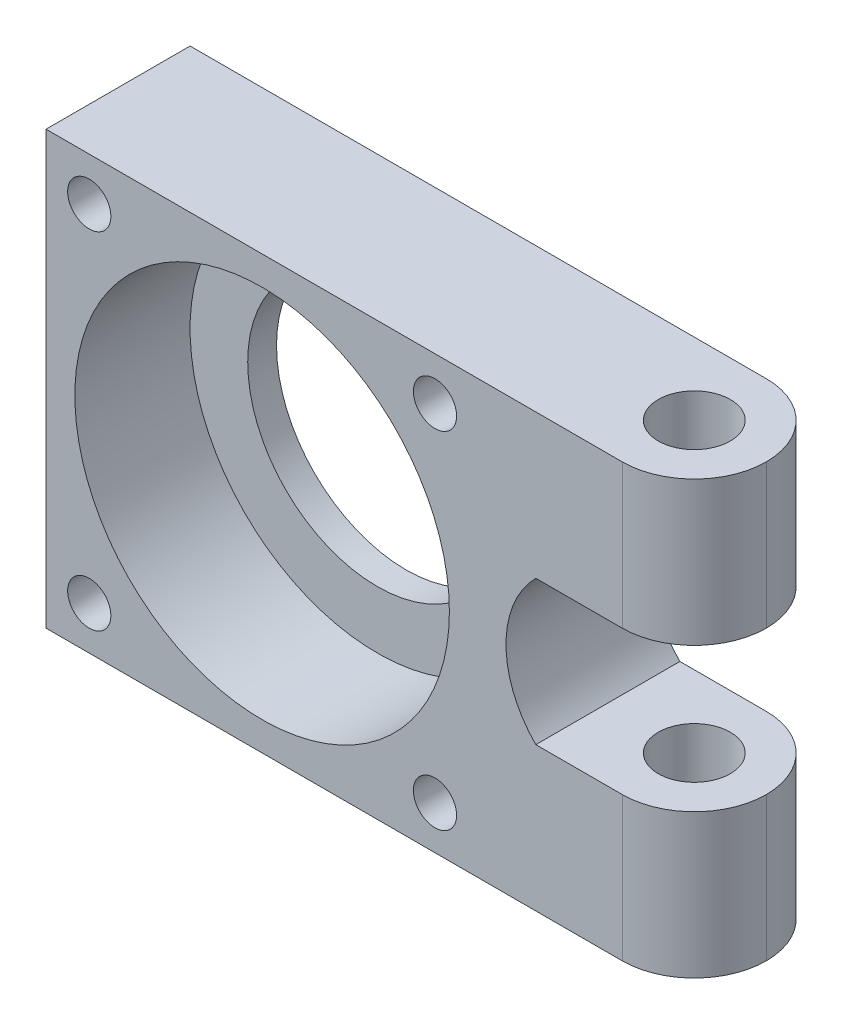
ISO-10303-21;
HEADER;
FILE_DESCRIPTION(('STEP AP214'),'2;1');
FILE_NAME('part.step','',(''),(''),'','','');
FILE_SCHEMA(('AUTOMOTIVE_DESIGN { 1 0 10303 214 1 1 1 1 }'));
ENDSEC;
DATA;
#1=APPLICATION_CONTEXT('core data for automotive mechanical design processes');
#2=APPLICATION_PROTOCOL_DEFINITION('international standard','automotive_design',2000,#1);
#3=PRODUCT_CONTEXT('',#1,'mechanical');
#4=PRODUCT('Part','Part','',(#3));
#5=PRODUCT_RELATED_PRODUCT_CATEGORY('part','',(#4));
#6=PRODUCT_DEFINITION_FORMATION('','',#4);
#7=PRODUCT_DEFINITION_CONTEXT('part definition',#1,'design');
#8=PRODUCT_DEFINITION('design','',#6,#7);
#9=PRODUCT_DEFINITION_SHAPE('','',#8);
#10=(LENGTH_UNIT() NAMED_UNIT(*) SI_UNIT(.MILLI.,.METRE.));
#11=(NAMED_UNIT(*) PLANE_ANGLE_UNIT() SI_UNIT($,.RADIAN.));
#12=(NAMED_UNIT(*) SI_UNIT($,.STERADIAN.) SOLID_ANGLE_UNIT());
#13=UNCERTAINTY_MEASURE_WITH_UNIT(LENGTH_MEASURE(1.E-05),#10,'distance_accuracy_value','');
#14=(GEOMETRIC_REPRESENTATION_CONTEXT(3) GLOBAL_UNCERTAINTY_ASSIGNED_CONTEXT((#13)) GLOBAL_UNIT_ASSIGNED_CONTEXT((#10,
#11,#12)) REPRESENTATION_CONTEXT('',''));
#15=CARTESIAN_POINT('',(0.,0.,0.));
#16=DIRECTION('',(0.,0.,1.));
#17=DIRECTION('',(1.,0.,0.));
#18=AXIS2_PLACEMENT_3D('',#15,#16,#17);
#19=CARTESIAN_POINT('',(-22.5,15.,10.));
#20=DIRECTION('',(1.,0.,0.));
#21=DIRECTION('',(0.,1.,0.));
#22=AXIS2_PLACEMENT_3D('',#19,#20,#21);
#23=PLANE('',#22);
#24=DIRECTION('',(0.,-1.,0.));
#25=VECTOR('',#24,1.);
#26=CARTESIAN_POINT('',(-22.5,15.,0.));
#27=LINE('',#26,#25);
#28=CARTESIAN_POINT('',(-22.5,15.,0.));
#29=VERTEX_POINT('',#28);
#30=CARTESIAN_POINT('',(-22.5,-15.,0.));
#31=VERTEX_POINT('',#30);
#32=EDGE_CURVE('E217',#29,#31,#27,.T.);
#33=ORIENTED_EDGE('',*,*,#32,.T.);
#34=DIRECTION('',(0.,0.,-1.));
#35=VECTOR('',#34,1.);
#36=CARTESIAN_POINT('',(-22.5,-15.,10.));
#37=LINE('',#36,#35);
#38=CARTESIAN_POINT('',(-22.5,-15.,10.));
#39=VERTEX_POINT('',#38);
#40=EDGE_CURVE('E150',#39,#31,#37,.T.);
#41=ORIENTED_EDGE('',*,*,#40,.F.);
#42=DIRECTION('',(0.,-1.,0.));
#43=VECTOR('',#42,1.);
#44=CARTESIAN_POINT('',(-22.5,15.,10.));
#45=LINE('',#44,#43);
#46=CARTESIAN_POINT('',(-22.5,15.,10.));
#47=VERTEX_POINT('',#46);
#48=EDGE_CURVE('E140',#47,#39,#45,.T.);
#49=ORIENTED_EDGE('',*,*,#48,.F.);
#50=DIRECTION('',(0.,0.,-1.));
#51=VECTOR('',#50,1.);
#52=CARTESIAN_POINT('',(-22.5,15.,10.));
#53=LINE('',#52,#51);
#54=EDGE_CURVE('E130',#47,#29,#53,.T.);
#55=ORIENTED_EDGE('',*,*,#54,.T.);
#56=EDGE_LOOP('',(#33,#41,#49,#55));
#57=FACE_BOUND('',#56,.T.);
#58=ADVANCED_FACE('F31',(#57),#23,.F.);
#59=CARTESIAN_POINT('',(-22.5,-15.,10.));
#60=DIRECTION('',(0.,1.,0.));
#61=DIRECTION('',(0.,0.,1.));
#62=AXIS2_PLACEMENT_3D('',#59,#60,#61);
#63=PLANE('',#62);
#64=CARTESIAN_POINT('',(17.5,-15.,5.));
#65=DIRECTION('',(0.,-1.,0.));
#66=DIRECTION('',(0.,0.,-1.));
#67=AXIS2_PLACEMENT_3D('',#64,#65,#66);
#68=CIRCLE('',#67,2.5);
#69=CARTESIAN_POINT('',(17.5,-15.,2.5));
#70=VERTEX_POINT('',#69);
#71=EDGE_CURVE('E120',#70,#70,#68,.T.);
#72=ORIENTED_EDGE('',*,*,#71,.F.);
#73=EDGE_LOOP('',(#72));
#74=FACE_BOUND('',#73,.T.);
#75=DIRECTION('',(1.,0.,0.));
#76=VECTOR('',#75,1.);
#77=CARTESIAN_POINT('',(-22.5,-15.,0.));
#78=LINE('',#77,#76);
#79=CARTESIAN_POINT('',(17.5,-15.,0.));
#80=VERTEX_POINT('',#79);
#81=EDGE_CURVE('E142',#31,#80,#78,.T.);
#82=ORIENTED_EDGE('',*,*,#81,.T.);
#83=CARTESIAN_POINT('',(17.5,-15.,5.));
#84=DIRECTION('',(0.,1.,0.));
#85=DIRECTION('',(0.,0.,1.));
#86=AXIS2_PLACEMENT_3D('',#83,#84,#85);
#87=CIRCLE('',#86,5.);
#88=CARTESIAN_POINT('',(22.5,-15.,5.));
#89=VERTEX_POINT('',#88);
#90=EDGE_CURVE('E11',#80,#89,#87,.F.);
#91=ORIENTED_EDGE('',*,*,#90,.T.);
#92=CARTESIAN_POINT('',(17.5,-15.,5.));
#93=DIRECTION('',(0.,1.,0.));
#94=DIRECTION('',(0.,0.,1.));
#95=AXIS2_PLACEMENT_3D('',#92,#93,#94);
#96=CIRCLE('',#95,5.);
#97=CARTESIAN_POINT('',(17.5,-15.,10.));
#98=VERTEX_POINT('',#97);
#99=EDGE_CURVE('E40',#89,#98,#96,.F.);
#100=ORIENTED_EDGE('',*,*,#99,.T.);
#101=DIRECTION('',(1.,0.,0.));
#102=VECTOR('',#101,1.);
#103=CARTESIAN_POINT('',(-22.5,-15.,10.));
#104=LINE('',#103,#102);
#105=EDGE_CURVE('E220',#39,#98,#104,.T.);
#106=ORIENTED_EDGE('',*,*,#105,.F.);
#107=ORIENTED_EDGE('',*,*,#40,.T.);
#108=EDGE_LOOP('',(#82,#91,#100,#106,#107));
#109=FACE_BOUND('',#108,.T.);
#110=ADVANCED_FACE('F228',(#74,#109),#63,.F.);
#111=CARTESIAN_POINT('',(11.5,-5.,10.));
#112=DIRECTION('',(0.,-1.,0.));
#113=DIRECTION('',(0.,0.,-1.));
#114=AXIS2_PLACEMENT_3D('',#111,#112,#113);
#115=PLANE('',#114);
#116=CARTESIAN_POINT('',(17.5,-5.,5.));
#117=DIRECTION('',(0.,-1.,0.));
#118=DIRECTION('',(0.,0.,-1.));
#119=AXIS2_PLACEMENT_3D('',#116,#117,#118);
#120=CIRCLE('',#119,2.5);
#121=CARTESIAN_POINT('',(17.5,-5.,2.5));
#122=VERTEX_POINT('',#121);
#123=EDGE_CURVE('E214',#122,#122,#120,.T.);
#124=ORIENTED_EDGE('',*,*,#123,.T.);
#125=EDGE_LOOP('',(#124));
#126=FACE_BOUND('',#125,.T.);
#127=CARTESIAN_POINT('',(17.5,-5.,5.));
#128=DIRECTION('',(0.,-1.,0.));
#129=DIRECTION('',(0.,0.,-1.));
#130=AXIS2_PLACEMENT_3D('',#127,#128,#129);
#131=CIRCLE('',#130,5.);
#132=CARTESIAN_POINT('',(17.5,-5.,10.));
#133=VERTEX_POINT('',#132);
#134=CARTESIAN_POINT('',(22.5,-5.,5.));
#135=VERTEX_POINT('',#134);
#136=EDGE_CURVE('E54',#133,#135,#131,.F.);
#137=ORIENTED_EDGE('',*,*,#136,.T.);
#138=CARTESIAN_POINT('',(17.5,-5.,5.));
#139=DIRECTION('',(0.,-1.,0.));
#140=DIRECTION('',(0.,0.,-1.));
#141=AXIS2_PLACEMENT_3D('',#138,#139,#140);
#142=CIRCLE('',#141,5.);
#143=CARTESIAN_POINT('',(17.5,-5.,0.));
#144=VERTEX_POINT('',#143);
#145=EDGE_CURVE('E170',#135,#144,#142,.F.);
#146=ORIENTED_EDGE('',*,*,#145,.T.);
#147=DIRECTION('',(-1.,0.,0.));
#148=VECTOR('',#147,1.);
#149=CARTESIAN_POINT('',(11.5,-5.,0.));
#150=LINE('',#149,#148);
#151=CARTESIAN_POINT('',(11.5,-5.,0.));
#152=VERTEX_POINT('',#151);
#153=EDGE_CURVE('E138',#144,#152,#150,.T.);
#154=ORIENTED_EDGE('',*,*,#153,.T.);
#155=DIRECTION('',(0.,0.,-1.));
#156=VECTOR('',#155,1.);
#157=CARTESIAN_POINT('',(11.5,-5.,10.));
#158=LINE('',#157,#156);
#159=CARTESIAN_POINT('',(11.5,-5.,10.));
#160=VERTEX_POINT('',#159);
#161=EDGE_CURVE('E116',#160,#152,#158,.T.);
#162=ORIENTED_EDGE('',*,*,#161,.F.);
#163=DIRECTION('',(-1.,0.,0.));
#164=VECTOR('',#163,1.);
#165=CARTESIAN_POINT('',(11.5,-5.,10.));
#166=LINE('',#165,#164);
#167=EDGE_CURVE('E223',#133,#160,#166,.T.);
#168=ORIENTED_EDGE('',*,*,#167,.F.);
#169=EDGE_LOOP('',(#137,#146,#154,#162,#168));
#170=FACE_BOUND('',#169,.T.);
#171=ADVANCED_FACE('F233',(#126,#170),#115,.F.);
#172=CARTESIAN_POINT('',(11.5,4.99999999999999,10.));
#173=DIRECTION('',(0.,1.,0.));
#174=DIRECTION('',(0.,0.,1.));
#175=AXIS2_PLACEMENT_3D('',#172,#173,#174);
#176=PLANE('',#175);
#177=CARTESIAN_POINT('',(17.5,4.99999999999999,5.));
#178=DIRECTION('',(0.,1.,0.));
#179=DIRECTION('',(0.,0.,1.));
#180=AXIS2_PLACEMENT_3D('',#177,#178,#179);
#181=CIRCLE('',#180,2.5);
#182=CARTESIAN_POINT('',(17.5,4.99999999999999,7.5));
#183=VERTEX_POINT('',#182);
#184=EDGE_CURVE('E211',#183,#183,#181,.T.);
#185=ORIENTED_EDGE('',*,*,#184,.T.);
#186=EDGE_LOOP('',(#185));
#187=FACE_BOUND('',#186,.T.);
#188=DIRECTION('',(1.,0.,0.));
#189=VECTOR('',#188,1.);
#190=CARTESIAN_POINT('',(11.5,4.99999999999999,0.));
#191=LINE('',#190,#189);
#192=CARTESIAN_POINT('',(11.5,4.99999999999999,0.));
#193=VERTEX_POINT('',#192);
#194=CARTESIAN_POINT('',(17.5,4.99999999999999,0.));
#195=VERTEX_POINT('',#194);
#196=EDGE_CURVE('E127',#193,#195,#191,.T.);
#197=ORIENTED_EDGE('',*,*,#196,.T.);
#198=CARTESIAN_POINT('',(17.5,4.99999999999999,5.));
#199=DIRECTION('',(0.,1.,0.));
#200=DIRECTION('',(0.,0.,1.));
#201=AXIS2_PLACEMENT_3D('',#198,#199,#200);
#202=CIRCLE('',#201,5.);
#203=CARTESIAN_POINT('',(22.5,4.99999999999999,5.));
#204=VERTEX_POINT('',#203);
#205=EDGE_CURVE('E163',#195,#204,#202,.F.);
#206=ORIENTED_EDGE('',*,*,#205,.T.);
#207=CARTESIAN_POINT('',(17.5,4.99999999999999,5.));
#208=DIRECTION('',(0.,1.,0.));
#209=DIRECTION('',(0.,0.,1.));
#210=AXIS2_PLACEMENT_3D('',#207,#208,#209);
#211=CIRCLE('',#210,5.);
#212=CARTESIAN_POINT('',(17.5,4.99999999999999,10.));
#213=VERTEX_POINT('',#212);
#214=EDGE_CURVE('E161',#204,#213,#211,.F.);
#215=ORIENTED_EDGE('',*,*,#214,.T.);
#216=DIRECTION('',(1.,0.,0.));
#217=VECTOR('',#216,1.);
#218=CARTESIAN_POINT('',(11.5,4.99999999999999,10.));
#219=LINE('',#218,#217);
#220=CARTESIAN_POINT('',(11.5,4.99999999999999,10.));
#221=VERTEX_POINT('',#220);
#222=EDGE_CURVE('E129',#221,#213,#219,.T.);
#223=ORIENTED_EDGE('',*,*,#222,.F.);
#224=DIRECTION('',(0.,0.,-1.));
#225=VECTOR('',#224,1.);
#226=CARTESIAN_POINT('',(11.5,4.99999999999999,10.));
#227=LINE('',#226,#225);
#228=EDGE_CURVE('E113',#221,#193,#227,.T.);
#229=ORIENTED_EDGE('',*,*,#228,.T.);
#230=EDGE_LOOP('',(#197,#206,#215,#223,#229));
#231=FACE_BOUND('',#230,.T.);
#232=ADVANCED_FACE('F126',(#187,#231),#176,.F.);
#233=CARTESIAN_POINT('',(-22.5,15.,10.));
#234=DIRECTION('',(0.,-1.,0.));
#235=DIRECTION('',(0.,0.,-1.));
#236=AXIS2_PLACEMENT_3D('',#233,#234,#235);
#237=PLANE('',#236);
#238=CARTESIAN_POINT('',(17.5,15.,5.));
#239=DIRECTION('',(0.,-1.,0.));
#240=DIRECTION('',(0.,0.,-1.));
#241=AXIS2_PLACEMENT_3D('',#238,#239,#240);
#242=CIRCLE('',#241,2.5);
#243=CARTESIAN_POINT('',(17.5,15.,2.5));
#244=VERTEX_POINT('',#243);
#245=EDGE_CURVE('E208',#244,#244,#242,.F.);
#246=ORIENTED_EDGE('',*,*,#245,.F.);
#247=EDGE_LOOP('',(#246));
#248=FACE_BOUND('',#247,.T.);
#249=CARTESIAN_POINT('',(17.5,15.,5.));
#250=DIRECTION('',(0.,-1.,0.));
#251=DIRECTION('',(0.,0.,-1.));
#252=AXIS2_PLACEMENT_3D('',#249,#250,#251);
#253=CIRCLE('',#252,5.);
#254=CARTESIAN_POINT('',(17.5,15.,10.));
#255=VERTEX_POINT('',#254);
#256=CARTESIAN_POINT('',(22.5,15.,5.));
#257=VERTEX_POINT('',#256);
#258=EDGE_CURVE('E153',#255,#257,#253,.F.);
#259=ORIENTED_EDGE('',*,*,#258,.T.);
#260=CARTESIAN_POINT('',(17.5,15.,5.));
#261=DIRECTION('',(0.,-1.,0.));
#262=DIRECTION('',(0.,0.,-1.));
#263=AXIS2_PLACEMENT_3D('',#260,#261,#262);
#264=CIRCLE('',#263,5.);
#265=CARTESIAN_POINT('',(17.5,15.,0.));
#266=VERTEX_POINT('',#265);
#267=EDGE_CURVE('E155',#257,#266,#264,.F.);
#268=ORIENTED_EDGE('',*,*,#267,.T.);
#269=DIRECTION('',(-1.,0.,0.));
#270=VECTOR('',#269,1.);
#271=CARTESIAN_POINT('',(-22.5,15.,0.));
#272=LINE('',#271,#270);
#273=EDGE_CURVE('E137',#266,#29,#272,.T.);
#274=ORIENTED_EDGE('',*,*,#273,.T.);
#275=ORIENTED_EDGE('',*,*,#54,.F.);
#276=DIRECTION('',(-1.,0.,0.));
#277=VECTOR('',#276,1.);
#278=CARTESIAN_POINT('',(-22.5,15.,10.));
#279=LINE('',#278,#277);
#280=EDGE_CURVE('E147',#255,#47,#279,.T.);
#281=ORIENTED_EDGE('',*,*,#280,.F.);
#282=EDGE_LOOP('',(#259,#268,#274,#275,#281));
#283=FACE_BOUND('',#282,.T.);
#284=ADVANCED_FACE('F243',(#248,#283),#237,.F.);
#285=CARTESIAN_POINT('',(-22.5,-15.,10.));
#286=DIRECTION('',(0.,0.,1.));
#287=DIRECTION('',(1.,0.,0.));
#288=AXIS2_PLACEMENT_3D('',#285,#286,#287);
#289=PLANE('',#288);
#290=CARTESIAN_POINT('',(4.50000000000001,-12.,10.));
#291=DIRECTION('',(0.,0.,1.));
#292=DIRECTION('',(-1.,0.,0.));
#293=AXIS2_PLACEMENT_3D('',#290,#291,#292);
#294=CIRCLE('',#293,1.5);
#295=CARTESIAN_POINT('',(3.00000000000001,-12.,10.));
#296=VERTEX_POINT('',#295);
#297=EDGE_CURVE('E321',#296,#296,#294,.T.);
#298=ORIENTED_EDGE('',*,*,#297,.F.);
#299=EDGE_LOOP('',(#298));
#300=FACE_BOUND('',#299,.T.);
#301=CARTESIAN_POINT('',(4.50000000000001,12.,10.));
#302=DIRECTION('',(0.,0.,1.));
#303=DIRECTION('',(1.,0.,0.));
#304=AXIS2_PLACEMENT_3D('',#301,#302,#303);
#305=CIRCLE('',#304,1.5);
#306=CARTESIAN_POINT('',(6.00000000000001,12.,10.));
#307=VERTEX_POINT('',#306);
#308=EDGE_CURVE('E323',#307,#307,#305,.T.);
#309=ORIENTED_EDGE('',*,*,#308,.F.);
#310=EDGE_LOOP('',(#309));
#311=FACE_BOUND('',#310,.T.);
#312=CARTESIAN_POINT('',(-19.5,12.,10.));
#313=DIRECTION('',(0.,0.,1.));
#314=DIRECTION('',(-1.,0.,0.));
#315=AXIS2_PLACEMENT_3D('',#312,#313,#314);
#316=CIRCLE('',#315,1.5);
#317=CARTESIAN_POINT('',(-21.,12.,10.));
#318=VERTEX_POINT('',#317);
#319=EDGE_CURVE('E194',#318,#318,#316,.T.);
#320=ORIENTED_EDGE('',*,*,#319,.F.);
#321=EDGE_LOOP('',(#320));
#322=FACE_BOUND('',#321,.T.);
#323=CARTESIAN_POINT('',(-19.5,-12.,10.));
#324=DIRECTION('',(0.,0.,1.));
#325=DIRECTION('',(1.,0.,0.));
#326=AXIS2_PLACEMENT_3D('',#323,#324,#325);
#327=CIRCLE('',#326,1.5);
#328=CARTESIAN_POINT('',(-18.,-12.,10.));
#329=VERTEX_POINT('',#328);
#330=EDGE_CURVE('E186',#329,#329,#327,.T.);
#331=ORIENTED_EDGE('',*,*,#330,.F.);
#332=EDGE_LOOP('',(#331));
#333=FACE_BOUND('',#332,.T.);
#334=CARTESIAN_POINT('',(-7.5,0.,10.));
#335=DIRECTION('',(0.,0.,1.));
#336=DIRECTION('',(1.,0.,0.));
#337=AXIS2_PLACEMENT_3D('',#334,#335,#336);
#338=CIRCLE('',#337,13.);
#339=CARTESIAN_POINT('',(5.50000000000001,0.,10.));
#340=VERTEX_POINT('',#339);
#341=EDGE_CURVE('E198',#340,#340,#338,.T.);
#342=ORIENTED_EDGE('',*,*,#341,.F.);
#343=EDGE_LOOP('',(#342));
#344=FACE_BOUND('',#343,.T.);
#345=ORIENTED_EDGE('',*,*,#222,.T.);
#346=DIRECTION('',(0.,1.,0.));
#347=VECTOR('',#346,1.);
#348=CARTESIAN_POINT('',(17.5,15.,10.));
#349=LINE('',#348,#347);
#350=EDGE_CURVE('E167',#213,#255,#349,.T.);
#351=ORIENTED_EDGE('',*,*,#350,.T.);
#352=ORIENTED_EDGE('',*,*,#280,.T.);
#353=ORIENTED_EDGE('',*,*,#48,.T.);
#354=ORIENTED_EDGE('',*,*,#105,.T.);
#355=DIRECTION('',(0.,1.,0.));
#356=VECTOR('',#355,1.);
#357=CARTESIAN_POINT('',(17.5,-5.00000000000001,10.));
#358=LINE('',#357,#356);
#359=EDGE_CURVE('E165',#98,#133,#358,.T.);
#360=ORIENTED_EDGE('',*,*,#359,.T.);
#361=ORIENTED_EDGE('',*,*,#167,.T.);
#362=CARTESIAN_POINT('',(16.5,0.,10.));
#363=DIRECTION('',(0.,0.,1.));
#364=DIRECTION('',(-1.,0.,0.));
#365=AXIS2_PLACEMENT_3D('',#362,#363,#364);
#366=CIRCLE('',#365,7.07106781186549);
#367=EDGE_CURVE('E121',#221,#160,#366,.T.);
#368=ORIENTED_EDGE('',*,*,#367,.F.);
#369=EDGE_LOOP('',(#345,#351,#352,#353,#354,#360,#361,#368));
#370=FACE_BOUND('',#369,.T.);
#371=ADVANCED_FACE('F237',(#300,#311,#322,#333,#344,#370),#289,.T.);
#372=CARTESIAN_POINT('',(-22.5,-15.,0.));
#373=DIRECTION('',(0.,0.,1.));
#374=DIRECTION('',(1.,0.,0.));
#375=AXIS2_PLACEMENT_3D('',#372,#373,#374);
#376=PLANE('',#375);
#377=CARTESIAN_POINT('',(4.50000000000001,-12.,0.));
#378=DIRECTION('',(0.,0.,1.));
#379=DIRECTION('',(-1.,0.,0.));
#380=AXIS2_PLACEMENT_3D('',#377,#378,#379);
#381=CIRCLE('',#380,1.5);
#382=CARTESIAN_POINT('',(3.00000000000001,-12.,0.));
#383=VERTEX_POINT('',#382);
#384=EDGE_CURVE('E318',#383,#383,#381,.T.);
#385=ORIENTED_EDGE('',*,*,#384,.T.);
#386=EDGE_LOOP('',(#385));
#387=FACE_BOUND('',#386,.T.);
#388=CARTESIAN_POINT('',(4.50000000000001,12.,0.));
#389=DIRECTION('',(0.,0.,1.));
#390=DIRECTION('',(1.,0.,0.));
#391=AXIS2_PLACEMENT_3D('',#388,#389,#390);
#392=CIRCLE('',#391,1.5);
#393=CARTESIAN_POINT('',(6.00000000000001,12.,0.));
#394=VERTEX_POINT('',#393);
#395=EDGE_CURVE('E326',#394,#394,#392,.T.);
#396=ORIENTED_EDGE('',*,*,#395,.T.);
#397=EDGE_LOOP('',(#396));
#398=FACE_BOUND('',#397,.T.);
#399=CARTESIAN_POINT('',(-19.5,12.,0.));
#400=DIRECTION('',(0.,0.,1.));
#401=DIRECTION('',(-1.,0.,0.));
#402=AXIS2_PLACEMENT_3D('',#399,#400,#401);
#403=CIRCLE('',#402,1.5);
#404=CARTESIAN_POINT('',(-21.,12.,0.));
#405=VERTEX_POINT('',#404);
#406=EDGE_CURVE('E191',#405,#405,#403,.T.);
#407=ORIENTED_EDGE('',*,*,#406,.T.);
#408=EDGE_LOOP('',(#407));
#409=FACE_BOUND('',#408,.T.);
#410=CARTESIAN_POINT('',(-19.5,-12.,0.));
#411=DIRECTION('',(0.,0.,1.));
#412=DIRECTION('',(1.,0.,0.));
#413=AXIS2_PLACEMENT_3D('',#410,#411,#412);
#414=CIRCLE('',#413,1.5);
#415=CARTESIAN_POINT('',(-18.,-12.,0.));
#416=VERTEX_POINT('',#415);
#417=EDGE_CURVE('E182',#416,#416,#414,.T.);
#418=ORIENTED_EDGE('',*,*,#417,.T.);
#419=EDGE_LOOP('',(#418));
#420=FACE_BOUND('',#419,.T.);
#421=CARTESIAN_POINT('',(-7.5,0.,0.));
#422=DIRECTION('',(0.,0.,1.));
#423=DIRECTION('',(1.,0.,0.));
#424=AXIS2_PLACEMENT_3D('',#421,#422,#423);
#425=CIRCLE('',#424,9.);
#426=CARTESIAN_POINT('',(1.5,0.,0.));
#427=VERTEX_POINT('',#426);
#428=EDGE_CURVE('E179',#427,#427,#425,.T.);
#429=ORIENTED_EDGE('',*,*,#428,.T.);
#430=EDGE_LOOP('',(#429));
#431=FACE_BOUND('',#430,.T.);
#432=ORIENTED_EDGE('',*,*,#273,.F.);
#433=DIRECTION('',(0.,1.,0.));
#434=VECTOR('',#433,1.);
#435=CARTESIAN_POINT('',(17.5,-15.,0.));
#436=LINE('',#435,#434);
#437=EDGE_CURVE('E136',#266,#195,#436,.F.);
#438=ORIENTED_EDGE('',*,*,#437,.T.);
#439=ORIENTED_EDGE('',*,*,#196,.F.);
#440=CARTESIAN_POINT('',(16.5,0.,0.));
#441=DIRECTION('',(0.,0.,1.));
#442=DIRECTION('',(-1.,0.,0.));
#443=AXIS2_PLACEMENT_3D('',#440,#441,#442);
#444=CIRCLE('',#443,7.07106781186549);
#445=EDGE_CURVE('E109',#193,#152,#444,.T.);
#446=ORIENTED_EDGE('',*,*,#445,.T.);
#447=ORIENTED_EDGE('',*,*,#153,.F.);
#448=DIRECTION('',(0.,1.,0.));
#449=VECTOR('',#448,1.);
#450=CARTESIAN_POINT('',(17.5,-15.,0.));
#451=LINE('',#450,#449);
#452=EDGE_CURVE('E157',#144,#80,#451,.F.);
#453=ORIENTED_EDGE('',*,*,#452,.T.);
#454=ORIENTED_EDGE('',*,*,#81,.F.);
#455=ORIENTED_EDGE('',*,*,#32,.F.);
#456=EDGE_LOOP('',(#432,#438,#439,#446,#447,#453,#454,#455));
#457=FACE_BOUND('',#456,.T.);
#458=ADVANCED_FACE('F134',(#387,#398,#409,#420,#431,#457),#376,.F.);
#459=CARTESIAN_POINT('',(17.5,22.0710678118655,5.));
#460=DIRECTION('',(0.,-1.,0.));
#461=DIRECTION('',(0.,0.,-1.));
#462=AXIS2_PLACEMENT_3D('',#459,#460,#461);
#463=CYLINDRICAL_SURFACE('',#462,2.5);
#464=ORIENTED_EDGE('',*,*,#245,.T.);
#465=EDGE_LOOP('',(#464));
#466=FACE_BOUND('',#465,.T.);
#467=ORIENTED_EDGE('',*,*,#184,.F.);
#468=EDGE_LOOP('',(#467));
#469=FACE_BOUND('',#468,.T.);
#470=ADVANCED_FACE('F280',(#466,#469),#463,.F.);
#471=ORIENTED_EDGE('',*,*,#71,.T.);
#472=EDGE_LOOP('',(#471));
#473=FACE_BOUND('',#472,.T.);
#474=ORIENTED_EDGE('',*,*,#123,.F.);
#475=EDGE_LOOP('',(#474));
#476=FACE_BOUND('',#475,.T.);
#477=ADVANCED_FACE('F285',(#473,#476),#463,.F.);
#478=CARTESIAN_POINT('',(16.5,0.,0.));
#479=DIRECTION('',(0.,0.,1.));
#480=DIRECTION('',(1.,0.,0.));
#481=AXIS2_PLACEMENT_3D('',#478,#479,#480);
#482=CYLINDRICAL_SURFACE('',#481,7.07106781186549);
#483=ORIENTED_EDGE('',*,*,#367,.T.);
#484=ORIENTED_EDGE('',*,*,#161,.T.);
#485=ORIENTED_EDGE('',*,*,#445,.F.);
#486=ORIENTED_EDGE('',*,*,#228,.F.);
#487=EDGE_LOOP('',(#483,#484,#485,#486));
#488=FACE_BOUND('',#487,.T.);
#489=ADVANCED_FACE('F112',(#488),#482,.F.);
#490=CARTESIAN_POINT('',(-7.5,0.,2.));
#491=DIRECTION('',(0.,0.,1.));
#492=DIRECTION('',(1.,0.,0.));
#493=AXIS2_PLACEMENT_3D('',#490,#491,#492);
#494=CYLINDRICAL_SURFACE('',#493,13.);
#495=CARTESIAN_POINT('',(-7.5,0.,2.));
#496=DIRECTION('',(0.,0.,1.));
#497=DIRECTION('',(1.,0.,0.));
#498=AXIS2_PLACEMENT_3D('',#495,#496,#497);
#499=CIRCLE('',#498,13.);
#500=CARTESIAN_POINT('',(5.50000000000001,0.,2.));
#501=VERTEX_POINT('',#500);
#502=EDGE_CURVE('E200',#501,#501,#499,.T.);
#503=ORIENTED_EDGE('',*,*,#502,.F.);
#504=EDGE_LOOP('',(#503));
#505=FACE_BOUND('',#504,.T.);
#506=ORIENTED_EDGE('',*,*,#341,.T.);
#507=EDGE_LOOP('',(#506));
#508=FACE_BOUND('',#507,.T.);
#509=ADVANCED_FACE('F291',(#505,#508),#494,.F.);
#510=CARTESIAN_POINT('',(-7.5,0.,2.));
#511=DIRECTION('',(0.,0.,1.));
#512=DIRECTION('',(1.,0.,0.));
#513=AXIS2_PLACEMENT_3D('',#510,#511,#512);
#514=PLANE('',#513);
#515=CARTESIAN_POINT('',(-7.5,0.,2.));
#516=DIRECTION('',(0.,0.,1.));
#517=DIRECTION('',(1.,0.,0.));
#518=AXIS2_PLACEMENT_3D('',#515,#516,#517);
#519=CIRCLE('',#518,9.);
#520=CARTESIAN_POINT('',(1.5,0.,2.));
#521=VERTEX_POINT('',#520);
#522=EDGE_CURVE('E174',#521,#521,#519,.T.);
#523=ORIENTED_EDGE('',*,*,#522,.F.);
#524=EDGE_LOOP('',(#523));
#525=FACE_BOUND('',#524,.T.);
#526=ORIENTED_EDGE('',*,*,#502,.T.);
#527=EDGE_LOOP('',(#526));
#528=FACE_BOUND('',#527,.T.);
#529=ADVANCED_FACE('F258',(#525,#528),#514,.T.);
#530=CARTESIAN_POINT('',(-7.5,0.,0.));
#531=DIRECTION('',(0.,0.,1.));
#532=DIRECTION('',(1.,0.,0.));
#533=AXIS2_PLACEMENT_3D('',#530,#531,#532);
#534=CYLINDRICAL_SURFACE('',#533,9.);
#535=ORIENTED_EDGE('',*,*,#428,.F.);
#536=EDGE_LOOP('',(#535));
#537=FACE_BOUND('',#536,.T.);
#538=ORIENTED_EDGE('',*,*,#522,.T.);
#539=EDGE_LOOP('',(#538));
#540=FACE_BOUND('',#539,.T.);
#541=ADVANCED_FACE('F251',(#537,#540),#534,.F.);
#542=CARTESIAN_POINT('',(17.5,-15.,5.));
#543=DIRECTION('',(0.,-1.,0.));
#544=DIRECTION('',(0.,0.,-1.));
#545=AXIS2_PLACEMENT_3D('',#542,#543,#544);
#546=CYLINDRICAL_SURFACE('',#545,5.);
#547=ORIENTED_EDGE('',*,*,#350,.F.);
#548=ORIENTED_EDGE('',*,*,#214,.F.);
#549=DIRECTION('',(0.,1.,0.));
#550=VECTOR('',#549,1.);
#551=CARTESIAN_POINT('',(22.5,4.99999999999999,5.));
#552=LINE('',#551,#550);
#553=EDGE_CURVE('E172',#257,#204,#552,.F.);
#554=ORIENTED_EDGE('',*,*,#553,.F.);
#555=ORIENTED_EDGE('',*,*,#258,.F.);
#556=EDGE_LOOP('',(#547,#548,#554,#555));
#557=FACE_BOUND('',#556,.T.);
#558=ADVANCED_FACE('F249',(#557),#546,.T.);
#559=CARTESIAN_POINT('',(17.5,15.,5.));
#560=DIRECTION('',(0.,1.,0.));
#561=DIRECTION('',(0.,0.,1.));
#562=AXIS2_PLACEMENT_3D('',#559,#560,#561);
#563=CYLINDRICAL_SURFACE('',#562,5.);
#564=ORIENTED_EDGE('',*,*,#205,.F.);
#565=ORIENTED_EDGE('',*,*,#437,.F.);
#566=ORIENTED_EDGE('',*,*,#267,.F.);
#567=ORIENTED_EDGE('',*,*,#553,.T.);
#568=EDGE_LOOP('',(#564,#565,#566,#567));
#569=FACE_BOUND('',#568,.T.);
#570=ADVANCED_FACE('F245',(#569),#563,.T.);
#571=CARTESIAN_POINT('',(17.5,-15.,5.));
#572=DIRECTION('',(0.,-1.,0.));
#573=DIRECTION('',(1.,0.,0.));
#574=AXIS2_PLACEMENT_3D('',#571,#572,#573);
#575=CYLINDRICAL_SURFACE('',#574,5.);
#576=ORIENTED_EDGE('',*,*,#359,.F.);
#577=ORIENTED_EDGE('',*,*,#99,.F.);
#578=DIRECTION('',(0.,1.,0.));
#579=VECTOR('',#578,1.);
#580=CARTESIAN_POINT('',(22.5,-15.,5.));
#581=LINE('',#580,#579);
#582=EDGE_CURVE('E35',#135,#89,#581,.F.);
#583=ORIENTED_EDGE('',*,*,#582,.F.);
#584=ORIENTED_EDGE('',*,*,#136,.F.);
#585=EDGE_LOOP('',(#576,#577,#583,#584));
#586=FACE_BOUND('',#585,.T.);
#587=ADVANCED_FACE('F33',(#586),#575,.T.);
#588=CARTESIAN_POINT('',(17.5,-5.00000000000001,5.));
#589=DIRECTION('',(0.,1.,0.));
#590=DIRECTION('',(-1.,0.,0.));
#591=AXIS2_PLACEMENT_3D('',#588,#589,#590);
#592=CYLINDRICAL_SURFACE('',#591,5.);
#593=ORIENTED_EDGE('',*,*,#90,.F.);
#594=ORIENTED_EDGE('',*,*,#452,.F.);
#595=ORIENTED_EDGE('',*,*,#145,.F.);
#596=ORIENTED_EDGE('',*,*,#582,.T.);
#597=EDGE_LOOP('',(#593,#594,#595,#596));
#598=FACE_BOUND('',#597,.T.);
#599=ADVANCED_FACE('F232',(#598),#592,.T.);
#600=CARTESIAN_POINT('',(-19.5,-12.,0.));
#601=DIRECTION('',(0.,0.,1.));
#602=DIRECTION('',(1.,0.,0.));
#603=AXIS2_PLACEMENT_3D('',#600,#601,#602);
#604=CYLINDRICAL_SURFACE('',#603,1.5);
#605=ORIENTED_EDGE('',*,*,#417,.F.);
#606=EDGE_LOOP('',(#605));
#607=FACE_BOUND('',#606,.T.);
#608=ORIENTED_EDGE('',*,*,#330,.T.);
#609=EDGE_LOOP('',(#608));
#610=FACE_BOUND('',#609,.T.);
#611=ADVANCED_FACE('F298',(#607,#610),#604,.F.);
#612=CARTESIAN_POINT('',(-19.5,12.,0.));
#613=DIRECTION('',(0.,0.,1.));
#614=DIRECTION('',(1.,0.,0.));
#615=AXIS2_PLACEMENT_3D('',#612,#613,#614);
#616=CYLINDRICAL_SURFACE('',#615,1.5);
#617=ORIENTED_EDGE('',*,*,#406,.F.);
#618=EDGE_LOOP('',(#617));
#619=FACE_BOUND('',#618,.T.);
#620=ORIENTED_EDGE('',*,*,#319,.T.);
#621=EDGE_LOOP('',(#620));
#622=FACE_BOUND('',#621,.T.);
#623=ADVANCED_FACE('F301',(#619,#622),#616,.F.);
#624=CARTESIAN_POINT('',(4.50000000000001,12.,0.));
#625=DIRECTION('',(0.,0.,1.));
#626=DIRECTION('',(1.,0.,0.));
#627=AXIS2_PLACEMENT_3D('',#624,#625,#626);
#628=CYLINDRICAL_SURFACE('',#627,1.5);
#629=ORIENTED_EDGE('',*,*,#395,.F.);
#630=EDGE_LOOP('',(#629));
#631=FACE_BOUND('',#630,.T.);
#632=ORIENTED_EDGE('',*,*,#308,.T.);
#633=EDGE_LOOP('',(#632));
#634=FACE_BOUND('',#633,.T.);
#635=ADVANCED_FACE('F305',(#631,#634),#628,.F.);
#636=CARTESIAN_POINT('',(4.50000000000001,-12.,0.));
#637=DIRECTION('',(0.,0.,1.));
#638=DIRECTION('',(1.,0.,0.));
#639=AXIS2_PLACEMENT_3D('',#636,#637,#638);
#640=CYLINDRICAL_SURFACE('',#639,1.5);
#641=ORIENTED_EDGE('',*,*,#384,.F.);
#642=EDGE_LOOP('',(#641));
#643=FACE_BOUND('',#642,.T.);
#644=ORIENTED_EDGE('',*,*,#297,.T.);
#645=EDGE_LOOP('',(#644));
#646=FACE_BOUND('',#645,.T.);
#647=ADVANCED_FACE('F309',(#643,#646),#640,.F.);
#648=CLOSED_SHELL('',(#58,#110,#171,#232,#284,#371,#458,#470,#477,#489,#509,#529,#541,#558,#570,
#587,#599,#611,#623,#635,#647));
#649=MANIFOLD_SOLID_BREP('B2',#648);
#650=ADVANCED_BREP_SHAPE_REPRESENTATION('',(#18,#649),#14);
#651=SHAPE_DEFINITION_REPRESENTATION(#9,#650);
ENDSEC;
END-ISO-10303-21;
